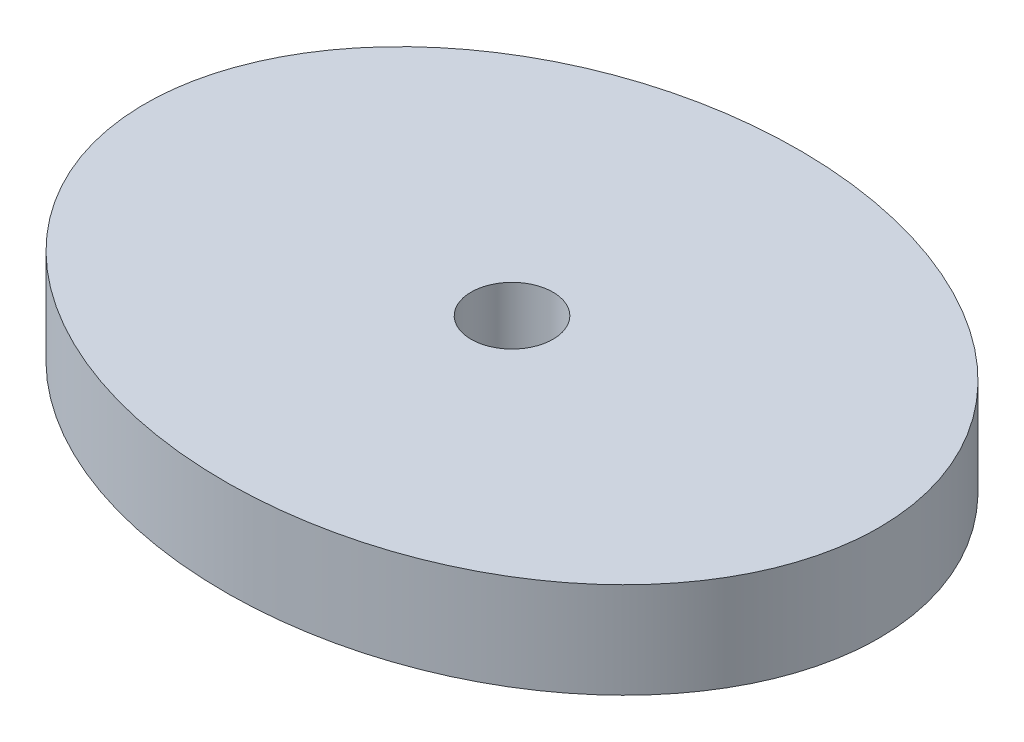
ISO-10303-21;
HEADER;
FILE_DESCRIPTION(('STEP AP214'),'2;1');
FILE_NAME('part.step','',(''),(''),'','','');
FILE_SCHEMA(('AUTOMOTIVE_DESIGN { 1 0 10303 214 1 1 1 1 }'));
ENDSEC;
DATA;
#1=APPLICATION_CONTEXT('core data for automotive mechanical design processes');
#2=APPLICATION_PROTOCOL_DEFINITION('international standard','automotive_design',2000,#1);
#3=PRODUCT_CONTEXT('',#1,'mechanical');
#4=PRODUCT('Part','Part','',(#3));
#5=PRODUCT_RELATED_PRODUCT_CATEGORY('part','',(#4));
#6=PRODUCT_DEFINITION_FORMATION('','',#4);
#7=PRODUCT_DEFINITION_CONTEXT('part definition',#1,'design');
#8=PRODUCT_DEFINITION('design','',#6,#7);
#9=PRODUCT_DEFINITION_SHAPE('','',#8);
#10=(LENGTH_UNIT() NAMED_UNIT(*) SI_UNIT(.MILLI.,.METRE.));
#11=(NAMED_UNIT(*) PLANE_ANGLE_UNIT() SI_UNIT($,.RADIAN.));
#12=(NAMED_UNIT(*) SI_UNIT($,.STERADIAN.) SOLID_ANGLE_UNIT());
#13=UNCERTAINTY_MEASURE_WITH_UNIT(LENGTH_MEASURE(1.E-05),#10,'distance_accuracy_value','');
#14=(GEOMETRIC_REPRESENTATION_CONTEXT(3) GLOBAL_UNCERTAINTY_ASSIGNED_CONTEXT((#13)) GLOBAL_UNIT_ASSIGNED_CONTEXT((#10,
#11,#12)) REPRESENTATION_CONTEXT('',''));
#15=CARTESIAN_POINT('',(0.,0.,0.));
#16=DIRECTION('',(0.,0.,1.));
#17=DIRECTION('',(1.,0.,0.));
#18=AXIS2_PLACEMENT_3D('',#15,#16,#17);
#19=CARTESIAN_POINT('',(0.,5.,0.));
#20=DIRECTION('',(0.,1.,0.));
#21=DIRECTION('',(1.,0.,0.));
#22=AXIS2_PLACEMENT_3D('',#19,#20,#21);
#23=ELLIPSE('',#22,19.175,15.);
#24=DIRECTION('',(0.,-1.,0.));
#25=VECTOR('',#24,1.);
#26=SURFACE_OF_LINEAR_EXTRUSION('',#23,#25);
#27=CARTESIAN_POINT('',(19.175,5.,0.));
#28=VERTEX_POINT('',#27);
#29=EDGE_CURVE('E10',#28,#28,#23,.T.);
#30=ORIENTED_EDGE('',*,*,#29,.F.);
#31=EDGE_LOOP('',(#30));
#32=FACE_BOUND('',#31,.T.);
#33=CARTESIAN_POINT('',(0.,0.,0.));
#34=DIRECTION('',(0.,1.,0.));
#35=DIRECTION('',(1.,0.,0.));
#36=AXIS2_PLACEMENT_3D('',#33,#34,#35);
#37=ELLIPSE('',#36,19.175,15.);
#38=CARTESIAN_POINT('',(19.175,0.,0.));
#39=VERTEX_POINT('',#38);
#40=EDGE_CURVE('E46',#39,#39,#37,.T.);
#41=ORIENTED_EDGE('',*,*,#40,.T.);
#42=EDGE_LOOP('',(#41));
#43=FACE_BOUND('',#42,.T.);
#44=ADVANCED_FACE('F42',(#32,#43),#26,.F.);
#45=CARTESIAN_POINT('',(0.,5.,0.));
#46=DIRECTION('',(0.,1.,0.));
#47=DIRECTION('',(0.,0.,1.));
#48=AXIS2_PLACEMENT_3D('',#45,#46,#47);
#49=PLANE('',#48);
#50=CARTESIAN_POINT('',(0.,5.,0.));
#51=DIRECTION('',(0.,1.,0.));
#52=DIRECTION('',(0.,0.,1.));
#53=AXIS2_PLACEMENT_3D('',#50,#51,#52);
#54=CIRCLE('',#53,2.1375);
#55=CARTESIAN_POINT('',(0.,5.,2.1375));
#56=VERTEX_POINT('',#55);
#57=EDGE_CURVE('E57',#56,#56,#54,.T.);
#58=ORIENTED_EDGE('',*,*,#57,.F.);
#59=EDGE_LOOP('',(#58));
#60=FACE_BOUND('',#59,.T.);
#61=ORIENTED_EDGE('',*,*,#29,.T.);
#62=EDGE_LOOP('',(#61));
#63=FACE_BOUND('',#62,.T.);
#64=ADVANCED_FACE('F74',(#60,#63),#49,.T.);
#65=CARTESIAN_POINT('',(0.,0.,0.));
#66=DIRECTION('',(0.,1.,0.));
#67=DIRECTION('',(0.,0.,1.));
#68=AXIS2_PLACEMENT_3D('',#65,#66,#67);
#69=PLANE('',#68);
#70=CARTESIAN_POINT('',(0.,0.,0.));
#71=DIRECTION('',(0.,1.,0.));
#72=DIRECTION('',(0.,0.,1.));
#73=AXIS2_PLACEMENT_3D('',#70,#71,#72);
#74=CIRCLE('',#73,2.1375);
#75=CARTESIAN_POINT('',(0.,0.,2.1375));
#76=VERTEX_POINT('',#75);
#77=EDGE_CURVE('E54',#76,#76,#74,.T.);
#78=ORIENTED_EDGE('',*,*,#77,.T.);
#79=EDGE_LOOP('',(#78));
#80=FACE_BOUND('',#79,.T.);
#81=ORIENTED_EDGE('',*,*,#40,.F.);
#82=EDGE_LOOP('',(#81));
#83=FACE_BOUND('',#82,.T.);
#84=ADVANCED_FACE('F65',(#80,#83),#69,.F.);
#85=CARTESIAN_POINT('',(0.,0.,0.));
#86=DIRECTION('',(0.,1.,0.));
#87=DIRECTION('',(0.,0.,1.));
#88=AXIS2_PLACEMENT_3D('',#85,#86,#87);
#89=CYLINDRICAL_SURFACE('',#88,2.1375);
#90=ORIENTED_EDGE('',*,*,#77,.F.);
#91=EDGE_LOOP('',(#90));
#92=FACE_BOUND('',#91,.T.);
#93=ORIENTED_EDGE('',*,*,#57,.T.);
#94=EDGE_LOOP('',(#93));
#95=FACE_BOUND('',#94,.T.);
#96=ADVANCED_FACE('F68',(#92,#95),#89,.F.);
#97=CLOSED_SHELL('',(#44,#64,#84,#96));
#98=MANIFOLD_SOLID_BREP('B2',#97);
#99=ADVANCED_BREP_SHAPE_REPRESENTATION('',(#18,#98),#14);
#100=SHAPE_DEFINITION_REPRESENTATION(#9,#99);
ENDSEC;
END-ISO-10303-21;
